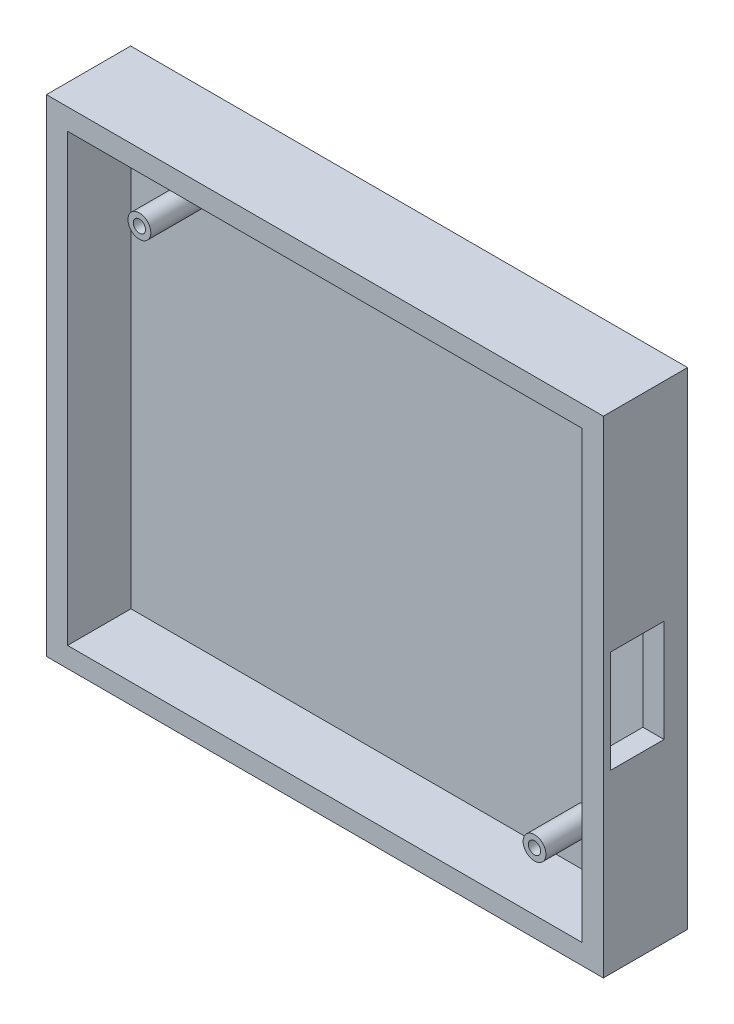
ISO-10303-21;
HEADER;
FILE_DESCRIPTION(('STEP AP214'),'2;1');
FILE_NAME('part.step','',(''),(''),'','','');
FILE_SCHEMA(('AUTOMOTIVE_DESIGN { 1 0 10303 214 1 1 1 1 }'));
ENDSEC;
DATA;
#1=APPLICATION_CONTEXT('core data for automotive mechanical design processes');
#2=APPLICATION_PROTOCOL_DEFINITION('international standard','automotive_design',2000,#1);
#3=PRODUCT_CONTEXT('',#1,'mechanical');
#4=PRODUCT('Part','Part','',(#3));
#5=PRODUCT_RELATED_PRODUCT_CATEGORY('part','',(#4));
#6=PRODUCT_DEFINITION_FORMATION('','',#4);
#7=PRODUCT_DEFINITION_CONTEXT('part definition',#1,'design');
#8=PRODUCT_DEFINITION('design','',#6,#7);
#9=PRODUCT_DEFINITION_SHAPE('','',#8);
#10=(LENGTH_UNIT() NAMED_UNIT(*) SI_UNIT(.MILLI.,.METRE.));
#11=(NAMED_UNIT(*) PLANE_ANGLE_UNIT() SI_UNIT($,.RADIAN.));
#12=(NAMED_UNIT(*) SI_UNIT($,.STERADIAN.) SOLID_ANGLE_UNIT());
#13=UNCERTAINTY_MEASURE_WITH_UNIT(LENGTH_MEASURE(1.E-05),#10,'distance_accuracy_value','');
#14=(GEOMETRIC_REPRESENTATION_CONTEXT(3) GLOBAL_UNCERTAINTY_ASSIGNED_CONTEXT((#13)) GLOBAL_UNIT_ASSIGNED_CONTEXT((#10,
#11,#12)) REPRESENTATION_CONTEXT('',''));
#15=CARTESIAN_POINT('',(0.,0.,0.));
#16=DIRECTION('',(0.,0.,1.));
#17=DIRECTION('',(1.,0.,0.));
#18=AXIS2_PLACEMENT_3D('',#15,#16,#17);
#19=CARTESIAN_POINT('',(0.,0.,1258.65249784237));
#20=DIRECTION('',(0.,0.,-1.));
#21=DIRECTION('',(-1.,0.,0.));
#22=AXIS2_PLACEMENT_3D('',#19,#20,#21);
#23=PLANE('',#22);
#24=DIRECTION('',(-1.,0.,0.));
#25=VECTOR('',#24,1.);
#26=CARTESIAN_POINT('',(0.,899.660798821983,1258.65249784237));
#27=LINE('',#26,#25);
#28=CARTESIAN_POINT('',(721.451856627697,899.660798821983,1258.65249784237));
#29=VERTEX_POINT('',#28);
#30=CARTESIAN_POINT('',(587.605010034027,899.660798821983,1258.65249784237));
#31=VERTEX_POINT('',#30);
#32=EDGE_CURVE('E180',#29,#31,#27,.T.);
#33=ORIENTED_EDGE('',*,*,#32,.F.);
#34=DIRECTION('',(0.,-1.,0.));
#35=VECTOR('',#34,1.);
#36=CARTESIAN_POINT('',(721.451856627697,0.,1258.65249784237));
#37=LINE('',#36,#35);
#38=CARTESIAN_POINT('',(721.451856627697,782.720878160815,1258.65249784237));
#39=VERTEX_POINT('',#38);
#40=EDGE_CURVE('E207',#29,#39,#37,.T.);
#41=ORIENTED_EDGE('',*,*,#40,.T.);
#42=DIRECTION('',(-1.,0.,0.));
#43=VECTOR('',#42,1.);
#44=CARTESIAN_POINT('',(0.,782.720878160815,1258.65249784237));
#45=LINE('',#44,#43);
#46=CARTESIAN_POINT('',(587.605010034027,782.720878160815,1258.65249784237));
#47=VERTEX_POINT('',#46);
#48=EDGE_CURVE('E215',#39,#47,#45,.T.);
#49=ORIENTED_EDGE('',*,*,#48,.T.);
#50=DIRECTION('',(0.,-1.,0.));
#51=VECTOR('',#50,1.);
#52=CARTESIAN_POINT('',(587.605010034027,0.,1258.65249784237));
#53=LINE('',#52,#51);
#54=EDGE_CURVE('E189',#31,#47,#53,.T.);
#55=ORIENTED_EDGE('',*,*,#54,.F.);
#56=EDGE_LOOP('',(#33,#41,#49,#55));
#57=FACE_BOUND('',#56,.T.);
#58=ADVANCED_FACE('F41',(#57),#23,.T.);
#59=CARTESIAN_POINT('',(716.371856627697,0.,1278.89249784237));
#60=DIRECTION('',(1.,0.,0.));
#61=DIRECTION('',(0.,0.,-1.));
#62=AXIS2_PLACEMENT_3D('',#59,#60,#61);
#63=PLANE('',#62);
#64=DIRECTION('',(0.,1.,0.));
#65=VECTOR('',#64,1.);
#66=CARTESIAN_POINT('',(716.371856627697,0.,1264.3012185459));
#67=LINE('',#66,#65);
#68=CARTESIAN_POINT('',(716.371856627697,825.075290209416,1264.3012185459));
#69=VERTEX_POINT('',#68);
#70=CARTESIAN_POINT('',(716.371856627697,849.699463737896,1264.3012185459));
#71=VERTEX_POINT('',#70);
#72=EDGE_CURVE('E159',#69,#71,#67,.T.);
#73=ORIENTED_EDGE('',*,*,#72,.T.);
#74=DIRECTION('',(0.,0.,1.));
#75=VECTOR('',#74,1.);
#76=CARTESIAN_POINT('',(716.371856627697,849.699463737896,1278.89249784237));
#77=LINE('',#76,#75);
#78=CARTESIAN_POINT('',(716.371856627697,849.699463737896,1277.13765715612));
#79=VERTEX_POINT('',#78);
#80=EDGE_CURVE('E162',#71,#79,#77,.T.);
#81=ORIENTED_EDGE('',*,*,#80,.T.);
#82=DIRECTION('',(0.,-1.,0.));
#83=VECTOR('',#82,1.);
#84=CARTESIAN_POINT('',(716.371856627697,0.,1277.13765715612));
#85=LINE('',#84,#83);
#86=CARTESIAN_POINT('',(716.371856627697,825.075290209416,1277.13765715612));
#87=VERTEX_POINT('',#86);
#88=EDGE_CURVE('E154',#79,#87,#85,.T.);
#89=ORIENTED_EDGE('',*,*,#88,.T.);
#90=DIRECTION('',(0.,0.,-1.));
#91=VECTOR('',#90,1.);
#92=CARTESIAN_POINT('',(716.371856627697,825.075290209416,1278.89249784237));
#93=LINE('',#92,#91);
#94=EDGE_CURVE('E132',#87,#69,#93,.T.);
#95=ORIENTED_EDGE('',*,*,#94,.T.);
#96=EDGE_LOOP('',(#73,#81,#89,#95));
#97=FACE_BOUND('',#96,.T.);
#98=DIRECTION('',(0.,0.,-1.));
#99=VECTOR('',#98,1.);
#100=CARTESIAN_POINT('',(716.371856627697,894.580798821983,1278.89249784237));
#101=LINE('',#100,#99);
#102=CARTESIAN_POINT('',(716.371856627697,894.580798821983,1278.89249784237));
#103=VERTEX_POINT('',#102);
#104=CARTESIAN_POINT('',(716.371856627697,894.580798821983,1263.65249784237));
#105=VERTEX_POINT('',#104);
#106=EDGE_CURVE('E206',#103,#105,#101,.T.);
#107=ORIENTED_EDGE('',*,*,#106,.T.);
#108=DIRECTION('',(0.,-1.,0.));
#109=VECTOR('',#108,1.);
#110=CARTESIAN_POINT('',(716.371856627697,0.,1263.65249784237));
#111=LINE('',#110,#109);
#112=CARTESIAN_POINT('',(716.371856627697,787.556428971502,1263.65249784237));
#113=VERTEX_POINT('',#112);
#114=EDGE_CURVE('E219',#105,#113,#111,.T.);
#115=ORIENTED_EDGE('',*,*,#114,.T.);
#116=DIRECTION('',(0.,0.,-1.));
#117=VECTOR('',#116,1.);
#118=CARTESIAN_POINT('',(716.371856627697,787.556428971502,1278.89249784237));
#119=LINE('',#118,#117);
#120=CARTESIAN_POINT('',(716.371856627697,787.556428971502,1278.89249784237));
#121=VERTEX_POINT('',#120);
#122=EDGE_CURVE('E230',#121,#113,#119,.T.);
#123=ORIENTED_EDGE('',*,*,#122,.F.);
#124=DIRECTION('',(0.,-1.,0.));
#125=VECTOR('',#124,1.);
#126=CARTESIAN_POINT('',(716.371856627697,0.,1278.89249784237));
#127=LINE('',#126,#125);
#128=EDGE_CURVE('E183',#103,#121,#127,.T.);
#129=ORIENTED_EDGE('',*,*,#128,.F.);
#130=EDGE_LOOP('',(#107,#115,#123,#129));
#131=FACE_BOUND('',#130,.T.);
#132=ADVANCED_FACE('F267',(#97,#131),#63,.F.);
#133=CARTESIAN_POINT('',(0.,787.556428971502,1278.89249784237));
#134=DIRECTION('',(0.,-1.,0.));
#135=DIRECTION('',(0.,0.,-1.));
#136=AXIS2_PLACEMENT_3D('',#133,#134,#135);
#137=PLANE('',#136);
#138=ORIENTED_EDGE('',*,*,#122,.T.);
#139=DIRECTION('',(-1.,0.,0.));
#140=VECTOR('',#139,1.);
#141=CARTESIAN_POINT('',(0.,787.556428971502,1263.65249784237));
#142=LINE('',#141,#140);
#143=CARTESIAN_POINT('',(592.685010034028,787.556428971502,1263.65249784237));
#144=VERTEX_POINT('',#143);
#145=EDGE_CURVE('E238',#113,#144,#142,.T.);
#146=ORIENTED_EDGE('',*,*,#145,.T.);
#147=DIRECTION('',(0.,0.,-1.));
#148=VECTOR('',#147,1.);
#149=CARTESIAN_POINT('',(592.685010034028,787.556428971502,1278.89249784237));
#150=LINE('',#149,#148);
#151=CARTESIAN_POINT('',(592.685010034028,787.556428971502,1278.89249784237));
#152=VERTEX_POINT('',#151);
#153=EDGE_CURVE('E227',#152,#144,#150,.T.);
#154=ORIENTED_EDGE('',*,*,#153,.F.);
#155=DIRECTION('',(-1.,0.,0.));
#156=VECTOR('',#155,1.);
#157=CARTESIAN_POINT('',(0.,787.556428971502,1278.89249784237));
#158=LINE('',#157,#156);
#159=EDGE_CURVE('E194',#121,#152,#158,.T.);
#160=ORIENTED_EDGE('',*,*,#159,.F.);
#161=EDGE_LOOP('',(#138,#146,#154,#160));
#162=FACE_BOUND('',#161,.T.);
#163=ADVANCED_FACE('F280',(#162),#137,.F.);
#164=CARTESIAN_POINT('',(0.,899.660798821983,1278.89249784237));
#165=DIRECTION('',(0.,-1.,0.));
#166=DIRECTION('',(0.,0.,-1.));
#167=AXIS2_PLACEMENT_3D('',#164,#165,#166);
#168=PLANE('',#167);
#169=ORIENTED_EDGE('',*,*,#32,.T.);
#170=DIRECTION('',(0.,0.,-1.));
#171=VECTOR('',#170,1.);
#172=CARTESIAN_POINT('',(587.605010034027,899.660798821983,1278.89249784237));
#173=LINE('',#172,#171);
#174=CARTESIAN_POINT('',(587.605010034027,899.660798821983,1278.89249784237));
#175=VERTEX_POINT('',#174);
#176=EDGE_CURVE('E220',#175,#31,#173,.T.);
#177=ORIENTED_EDGE('',*,*,#176,.F.);
#178=DIRECTION('',(-1.,0.,0.));
#179=VECTOR('',#178,1.);
#180=CARTESIAN_POINT('',(0.,899.660798821983,1278.89249784237));
#181=LINE('',#180,#179);
#182=CARTESIAN_POINT('',(721.451856627697,899.660798821983,1278.89249784237));
#183=VERTEX_POINT('',#182);
#184=EDGE_CURVE('E193',#183,#175,#181,.T.);
#185=ORIENTED_EDGE('',*,*,#184,.F.);
#186=DIRECTION('',(0.,0.,-1.));
#187=VECTOR('',#186,1.);
#188=CARTESIAN_POINT('',(721.451856627697,899.660798821983,1278.89249784237));
#189=LINE('',#188,#187);
#190=EDGE_CURVE('E223',#183,#29,#189,.T.);
#191=ORIENTED_EDGE('',*,*,#190,.T.);
#192=EDGE_LOOP('',(#169,#177,#185,#191));
#193=FACE_BOUND('',#192,.T.);
#194=ADVANCED_FACE('F276',(#193),#168,.F.);
#195=CARTESIAN_POINT('',(587.605010034027,0.,1278.89249784237));
#196=DIRECTION('',(1.,0.,0.));
#197=DIRECTION('',(0.,0.,-1.));
#198=AXIS2_PLACEMENT_3D('',#195,#196,#197);
#199=PLANE('',#198);
#200=ORIENTED_EDGE('',*,*,#54,.T.);
#201=DIRECTION('',(0.,0.,-1.));
#202=VECTOR('',#201,1.);
#203=CARTESIAN_POINT('',(587.605010034027,782.720878160815,1278.89249784237));
#204=LINE('',#203,#202);
#205=CARTESIAN_POINT('',(587.605010034027,782.720878160815,1278.89249784237));
#206=VERTEX_POINT('',#205);
#207=EDGE_CURVE('E222',#206,#47,#204,.T.);
#208=ORIENTED_EDGE('',*,*,#207,.F.);
#209=DIRECTION('',(0.,-1.,0.));
#210=VECTOR('',#209,1.);
#211=CARTESIAN_POINT('',(587.605010034027,0.,1278.89249784237));
#212=LINE('',#211,#210);
#213=EDGE_CURVE('E204',#175,#206,#212,.T.);
#214=ORIENTED_EDGE('',*,*,#213,.F.);
#215=ORIENTED_EDGE('',*,*,#176,.T.);
#216=EDGE_LOOP('',(#200,#208,#214,#215));
#217=FACE_BOUND('',#216,.T.);
#218=ADVANCED_FACE('F282',(#217),#199,.F.);
#219=CARTESIAN_POINT('',(0.,782.720878160815,1278.89249784237));
#220=DIRECTION('',(0.,-1.,0.));
#221=DIRECTION('',(0.,0.,-1.));
#222=AXIS2_PLACEMENT_3D('',#219,#220,#221);
#223=PLANE('',#222);
#224=ORIENTED_EDGE('',*,*,#48,.F.);
#225=DIRECTION('',(0.,0.,-1.));
#226=VECTOR('',#225,1.);
#227=CARTESIAN_POINT('',(721.451856627697,782.720878160815,1278.89249784237));
#228=LINE('',#227,#226);
#229=CARTESIAN_POINT('',(721.451856627697,782.720878160815,1278.89249784237));
#230=VERTEX_POINT('',#229);
#231=EDGE_CURVE('E224',#230,#39,#228,.T.);
#232=ORIENTED_EDGE('',*,*,#231,.F.);
#233=DIRECTION('',(-1.,0.,0.));
#234=VECTOR('',#233,1.);
#235=CARTESIAN_POINT('',(0.,782.720878160815,1278.89249784237));
#236=LINE('',#235,#234);
#237=EDGE_CURVE('E203',#230,#206,#236,.T.);
#238=ORIENTED_EDGE('',*,*,#237,.T.);
#239=ORIENTED_EDGE('',*,*,#207,.T.);
#240=EDGE_LOOP('',(#224,#232,#238,#239));
#241=FACE_BOUND('',#240,.T.);
#242=ADVANCED_FACE('F304',(#241),#223,.T.);
#243=CARTESIAN_POINT('',(592.685010034028,0.,1278.89249784237));
#244=DIRECTION('',(-1.,0.,0.));
#245=DIRECTION('',(0.,0.,1.));
#246=AXIS2_PLACEMENT_3D('',#243,#244,#245);
#247=PLANE('',#246);
#248=DIRECTION('',(0.,-1.,0.));
#249=VECTOR('',#248,1.);
#250=CARTESIAN_POINT('',(592.685010034028,0.,1263.65249784237));
#251=LINE('',#250,#249);
#252=CARTESIAN_POINT('',(592.685010034028,894.580798821983,1263.65249784237));
#253=VERTEX_POINT('',#252);
#254=EDGE_CURVE('E241',#253,#144,#251,.T.);
#255=ORIENTED_EDGE('',*,*,#254,.F.);
#256=DIRECTION('',(0.,0.,-1.));
#257=VECTOR('',#256,1.);
#258=CARTESIAN_POINT('',(592.685010034028,894.580798821983,1278.89249784237));
#259=LINE('',#258,#257);
#260=CARTESIAN_POINT('',(592.685010034028,894.580798821983,1278.89249784237));
#261=VERTEX_POINT('',#260);
#262=EDGE_CURVE('E234',#261,#253,#259,.T.);
#263=ORIENTED_EDGE('',*,*,#262,.F.);
#264=DIRECTION('',(0.,1.,0.));
#265=VECTOR('',#264,1.);
#266=CARTESIAN_POINT('',(592.685010034028,0.,1278.89249784237));
#267=LINE('',#266,#265);
#268=EDGE_CURVE('E192',#152,#261,#267,.T.);
#269=ORIENTED_EDGE('',*,*,#268,.F.);
#270=ORIENTED_EDGE('',*,*,#153,.T.);
#271=EDGE_LOOP('',(#255,#263,#269,#270));
#272=FACE_BOUND('',#271,.T.);
#273=ADVANCED_FACE('F274',(#272),#247,.F.);
#274=CARTESIAN_POINT('',(0.,894.580798821983,1278.89249784237));
#275=DIRECTION('',(0.,1.,0.));
#276=DIRECTION('',(0.,0.,1.));
#277=AXIS2_PLACEMENT_3D('',#274,#275,#276);
#278=PLANE('',#277);
#279=DIRECTION('',(-1.,0.,0.));
#280=VECTOR('',#279,1.);
#281=CARTESIAN_POINT('',(0.,894.580798821983,1263.65249784237));
#282=LINE('',#281,#280);
#283=EDGE_CURVE('E242',#105,#253,#282,.T.);
#284=ORIENTED_EDGE('',*,*,#283,.F.);
#285=ORIENTED_EDGE('',*,*,#106,.F.);
#286=DIRECTION('',(1.,0.,0.));
#287=VECTOR('',#286,1.);
#288=CARTESIAN_POINT('',(0.,894.580798821983,1278.89249784237));
#289=LINE('',#288,#287);
#290=EDGE_CURVE('E186',#261,#103,#289,.T.);
#291=ORIENTED_EDGE('',*,*,#290,.F.);
#292=ORIENTED_EDGE('',*,*,#262,.T.);
#293=EDGE_LOOP('',(#284,#285,#291,#292));
#294=FACE_BOUND('',#293,.T.);
#295=ADVANCED_FACE('F264',(#294),#278,.F.);
#296=CARTESIAN_POINT('',(721.451856627697,0.,1278.89249784237));
#297=DIRECTION('',(1.,0.,0.));
#298=DIRECTION('',(0.,0.,-1.));
#299=AXIS2_PLACEMENT_3D('',#296,#297,#298);
#300=PLANE('',#299);
#301=DIRECTION('',(0.,0.,1.));
#302=VECTOR('',#301,1.);
#303=CARTESIAN_POINT('',(721.451856627697,849.699463737896,1277.13765715612));
#304=LINE('',#303,#302);
#305=CARTESIAN_POINT('',(721.451856627697,849.699463737896,1264.3012185459));
#306=VERTEX_POINT('',#305);
#307=CARTESIAN_POINT('',(721.451856627697,849.699463737896,1277.13765715612));
#308=VERTEX_POINT('',#307);
#309=EDGE_CURVE('E61',#306,#308,#304,.T.);
#310=ORIENTED_EDGE('',*,*,#309,.F.);
#311=DIRECTION('',(0.,1.,0.));
#312=VECTOR('',#311,1.);
#313=CARTESIAN_POINT('',(721.451856627697,849.699463737896,1264.3012185459));
#314=LINE('',#313,#312);
#315=CARTESIAN_POINT('',(721.451856627697,825.075290209416,1264.3012185459));
#316=VERTEX_POINT('',#315);
#317=EDGE_CURVE('E146',#316,#306,#314,.T.);
#318=ORIENTED_EDGE('',*,*,#317,.F.);
#319=DIRECTION('',(0.,0.,-1.));
#320=VECTOR('',#319,1.);
#321=CARTESIAN_POINT('',(721.451856627697,825.075290209416,1277.13765715612));
#322=LINE('',#321,#320);
#323=CARTESIAN_POINT('',(721.451856627697,825.075290209416,1277.13765715612));
#324=VERTEX_POINT('',#323);
#325=EDGE_CURVE('E135',#324,#316,#322,.T.);
#326=ORIENTED_EDGE('',*,*,#325,.F.);
#327=DIRECTION('',(0.,-1.,0.));
#328=VECTOR('',#327,1.);
#329=CARTESIAN_POINT('',(721.451856627697,849.699463737896,1277.13765715612));
#330=LINE('',#329,#328);
#331=EDGE_CURVE('E143',#308,#324,#330,.T.);
#332=ORIENTED_EDGE('',*,*,#331,.F.);
#333=EDGE_LOOP('',(#310,#318,#326,#332));
#334=FACE_BOUND('',#333,.T.);
#335=ORIENTED_EDGE('',*,*,#40,.F.);
#336=ORIENTED_EDGE('',*,*,#190,.F.);
#337=DIRECTION('',(0.,-1.,0.));
#338=VECTOR('',#337,1.);
#339=CARTESIAN_POINT('',(721.451856627697,0.,1278.89249784237));
#340=LINE('',#339,#338);
#341=EDGE_CURVE('E196',#183,#230,#340,.T.);
#342=ORIENTED_EDGE('',*,*,#341,.T.);
#343=ORIENTED_EDGE('',*,*,#231,.T.);
#344=EDGE_LOOP('',(#335,#336,#342,#343));
#345=FACE_BOUND('',#344,.T.);
#346=ADVANCED_FACE('F144',(#334,#345),#300,.T.);
#347=CARTESIAN_POINT('',(0.,0.,1278.89249784237));
#348=DIRECTION('',(0.,0.,-1.));
#349=DIRECTION('',(-1.,0.,0.));
#350=AXIS2_PLACEMENT_3D('',#347,#348,#349);
#351=PLANE('',#350);
#352=ORIENTED_EDGE('',*,*,#128,.T.);
#353=ORIENTED_EDGE('',*,*,#159,.T.);
#354=ORIENTED_EDGE('',*,*,#268,.T.);
#355=ORIENTED_EDGE('',*,*,#290,.T.);
#356=EDGE_LOOP('',(#352,#353,#354,#355));
#357=FACE_BOUND('',#356,.T.);
#358=ORIENTED_EDGE('',*,*,#184,.T.);
#359=ORIENTED_EDGE('',*,*,#213,.T.);
#360=ORIENTED_EDGE('',*,*,#237,.F.);
#361=ORIENTED_EDGE('',*,*,#341,.F.);
#362=EDGE_LOOP('',(#358,#359,#360,#361));
#363=FACE_BOUND('',#362,.T.);
#364=ADVANCED_FACE('F254',(#357,#363),#351,.F.);
#365=CARTESIAN_POINT('',(0.,0.,1263.65249784237));
#366=DIRECTION('',(0.,0.,-1.));
#367=DIRECTION('',(-1.,0.,0.));
#368=AXIS2_PLACEMENT_3D('',#365,#366,#367);
#369=PLANE('',#368);
#370=CARTESIAN_POINT('',(607.327962295804,880.840943569991,1263.65249784237));
#371=DIRECTION('',(0.,0.,-1.));
#372=DIRECTION('',(-1.,0.,0.));
#373=AXIS2_PLACEMENT_3D('',#370,#371,#372);
#374=CIRCLE('',#373,2.74500000000004);
#375=CARTESIAN_POINT('',(604.582962295804,880.840943569991,1263.65249784237));
#376=VERTEX_POINT('',#375);
#377=EDGE_CURVE('E11',#376,#376,#374,.F.);
#378=ORIENTED_EDGE('',*,*,#377,.F.);
#379=EDGE_LOOP('',(#378));
#380=FACE_BOUND('',#379,.T.);
#381=CARTESIAN_POINT('',(702.289411045068,798.927110343082,1263.65249784237));
#382=DIRECTION('',(0.,0.,-1.));
#383=DIRECTION('',(-1.,0.,0.));
#384=AXIS2_PLACEMENT_3D('',#381,#382,#383);
#385=CIRCLE('',#384,2.74500000000004);
#386=CARTESIAN_POINT('',(699.544411045068,798.927110343082,1263.65249784237));
#387=VERTEX_POINT('',#386);
#388=EDGE_CURVE('E48',#387,#387,#385,.F.);
#389=ORIENTED_EDGE('',*,*,#388,.F.);
#390=EDGE_LOOP('',(#389));
#391=FACE_BOUND('',#390,.T.);
#392=ORIENTED_EDGE('',*,*,#114,.F.);
#393=ORIENTED_EDGE('',*,*,#283,.T.);
#394=ORIENTED_EDGE('',*,*,#254,.T.);
#395=ORIENTED_EDGE('',*,*,#145,.F.);
#396=EDGE_LOOP('',(#392,#393,#394,#395));
#397=FACE_BOUND('',#396,.T.);
#398=ADVANCED_FACE('F253',(#380,#391,#397),#369,.F.);
#399=CARTESIAN_POINT('',(702.289411045068,798.927110343082,1276.27249784237));
#400=DIRECTION('',(0.,0.,1.));
#401=DIRECTION('',(1.,0.,0.));
#402=AXIS2_PLACEMENT_3D('',#399,#400,#401);
#403=PLANE('',#402);
#404=CARTESIAN_POINT('',(702.289411045068,798.927110343082,1276.27249784237));
#405=DIRECTION('',(0.,0.,1.));
#406=DIRECTION('',(1.,0.,0.));
#407=AXIS2_PLACEMENT_3D('',#404,#405,#406);
#408=CIRCLE('',#407,2.74500000000004);
#409=CARTESIAN_POINT('',(705.034411045068,798.927110343082,1276.27249784237));
#410=VERTEX_POINT('',#409);
#411=EDGE_CURVE('E167',#410,#410,#408,.T.);
#412=ORIENTED_EDGE('',*,*,#411,.T.);
#413=EDGE_LOOP('',(#412));
#414=FACE_BOUND('',#413,.T.);
#415=CARTESIAN_POINT('',(702.289411045068,798.927110343082,1276.27249784237));
#416=DIRECTION('',(0.,0.,1.));
#417=DIRECTION('',(1.,0.,0.));
#418=AXIS2_PLACEMENT_3D('',#415,#416,#417);
#419=CIRCLE('',#418,1.47500000000002);
#420=CARTESIAN_POINT('',(703.764411045068,798.927110343082,1276.27249784237));
#421=VERTEX_POINT('',#420);
#422=EDGE_CURVE('E178',#421,#421,#419,.T.);
#423=ORIENTED_EDGE('',*,*,#422,.F.);
#424=EDGE_LOOP('',(#423));
#425=FACE_BOUND('',#424,.T.);
#426=ADVANCED_FACE('F255',(#414,#425),#403,.T.);
#427=CARTESIAN_POINT('',(702.289411045068,798.927110343082,1276.27249784237));
#428=DIRECTION('',(0.,0.,-1.));
#429=DIRECTION('',(-1.,0.,0.));
#430=AXIS2_PLACEMENT_3D('',#427,#428,#429);
#431=CYLINDRICAL_SURFACE('',#430,2.74500000000004);
#432=ORIENTED_EDGE('',*,*,#411,.F.);
#433=EDGE_LOOP('',(#432));
#434=FACE_BOUND('',#433,.T.);
#435=ORIENTED_EDGE('',*,*,#388,.T.);
#436=EDGE_LOOP('',(#435));
#437=FACE_BOUND('',#436,.T.);
#438=ADVANCED_FACE('F246',(#434,#437),#431,.T.);
#439=CARTESIAN_POINT('',(702.289411045068,798.927110343082,1276.27249784237));
#440=DIRECTION('',(0.,0.,-1.));
#441=DIRECTION('',(-1.,0.,0.));
#442=AXIS2_PLACEMENT_3D('',#439,#440,#441);
#443=CYLINDRICAL_SURFACE('',#442,1.47500000000002);
#444=ORIENTED_EDGE('',*,*,#422,.T.);
#445=EDGE_LOOP('',(#444));
#446=FACE_BOUND('',#445,.T.);
#447=CARTESIAN_POINT('',(702.289411045068,798.927110343082,1263.65249784237));
#448=DIRECTION('',(0.,0.,1.));
#449=DIRECTION('',(1.,0.,0.));
#450=AXIS2_PLACEMENT_3D('',#447,#448,#449);
#451=CIRCLE('',#450,1.47500000000002);
#452=CARTESIAN_POINT('',(703.764411045068,798.927110343082,1263.65249784237));
#453=VERTEX_POINT('',#452);
#454=EDGE_CURVE('E174',#453,#453,#451,.T.);
#455=ORIENTED_EDGE('',*,*,#454,.F.);
#456=EDGE_LOOP('',(#455));
#457=FACE_BOUND('',#456,.T.);
#458=ADVANCED_FACE('F312',(#446,#457),#443,.F.);
#459=CARTESIAN_POINT('',(607.327962295804,880.840943569991,1276.27249784237));
#460=DIRECTION('',(0.,0.,1.));
#461=DIRECTION('',(1.,0.,0.));
#462=AXIS2_PLACEMENT_3D('',#459,#460,#461);
#463=PLANE('',#462);
#464=CARTESIAN_POINT('',(607.327962295804,880.840943569991,1276.27249784237));
#465=DIRECTION('',(0.,0.,1.));
#466=DIRECTION('',(1.,0.,0.));
#467=AXIS2_PLACEMENT_3D('',#464,#465,#466);
#468=CIRCLE('',#467,2.74500000000004);
#469=CARTESIAN_POINT('',(610.072962295804,880.840943569991,1276.27249784237));
#470=VERTEX_POINT('',#469);
#471=EDGE_CURVE('E168',#470,#470,#468,.T.);
#472=ORIENTED_EDGE('',*,*,#471,.T.);
#473=EDGE_LOOP('',(#472));
#474=FACE_BOUND('',#473,.T.);
#475=CARTESIAN_POINT('',(607.327962295804,880.840943569991,1276.27249784237));
#476=DIRECTION('',(0.,0.,1.));
#477=DIRECTION('',(1.,0.,0.));
#478=AXIS2_PLACEMENT_3D('',#475,#476,#477);
#479=CIRCLE('',#478,1.47500000000002);
#480=CARTESIAN_POINT('',(608.802962295804,880.840943569991,1276.27249784237));
#481=VERTEX_POINT('',#480);
#482=EDGE_CURVE('E170',#481,#481,#479,.T.);
#483=ORIENTED_EDGE('',*,*,#482,.F.);
#484=EDGE_LOOP('',(#483));
#485=FACE_BOUND('',#484,.T.);
#486=ADVANCED_FACE('F383',(#474,#485),#463,.T.);
#487=CARTESIAN_POINT('',(607.327962295804,880.840943569991,1276.27249784237));
#488=DIRECTION('',(0.,0.,-1.));
#489=DIRECTION('',(-1.,0.,0.));
#490=AXIS2_PLACEMENT_3D('',#487,#488,#489);
#491=CYLINDRICAL_SURFACE('',#490,2.74500000000004);
#492=ORIENTED_EDGE('',*,*,#471,.F.);
#493=EDGE_LOOP('',(#492));
#494=FACE_BOUND('',#493,.T.);
#495=ORIENTED_EDGE('',*,*,#377,.T.);
#496=EDGE_LOOP('',(#495));
#497=FACE_BOUND('',#496,.T.);
#498=ADVANCED_FACE('F391',(#494,#497),#491,.T.);
#499=CARTESIAN_POINT('',(607.327962295804,880.840943569991,1276.27249784237));
#500=DIRECTION('',(0.,0.,-1.));
#501=DIRECTION('',(-1.,0.,0.));
#502=AXIS2_PLACEMENT_3D('',#499,#500,#501);
#503=CYLINDRICAL_SURFACE('',#502,1.47500000000002);
#504=ORIENTED_EDGE('',*,*,#482,.T.);
#505=EDGE_LOOP('',(#504));
#506=FACE_BOUND('',#505,.T.);
#507=CARTESIAN_POINT('',(607.327962295804,880.840943569991,1263.65249784237));
#508=DIRECTION('',(0.,0.,1.));
#509=DIRECTION('',(1.,0.,0.));
#510=AXIS2_PLACEMENT_3D('',#507,#508,#509);
#511=CIRCLE('',#510,1.47500000000002);
#512=CARTESIAN_POINT('',(608.802962295804,880.840943569991,1263.65249784237));
#513=VERTEX_POINT('',#512);
#514=EDGE_CURVE('E173',#513,#513,#511,.T.);
#515=ORIENTED_EDGE('',*,*,#514,.F.);
#516=EDGE_LOOP('',(#515));
#517=FACE_BOUND('',#516,.T.);
#518=ADVANCED_FACE('F353',(#506,#517),#503,.F.);
#519=ORIENTED_EDGE('',*,*,#454,.T.);
#520=EDGE_LOOP('',(#519));
#521=FACE_BOUND('',#520,.T.);
#522=ADVANCED_FACE('F256',(#521),#369,.F.);
#523=ORIENTED_EDGE('',*,*,#514,.T.);
#524=EDGE_LOOP('',(#523));
#525=FACE_BOUND('',#524,.T.);
#526=ADVANCED_FACE('F260',(#525),#369,.F.);
#527=CARTESIAN_POINT('',(711.451856627697,849.699463737896,1277.13765715612));
#528=DIRECTION('',(0.,1.,0.));
#529=DIRECTION('',(0.,0.,1.));
#530=AXIS2_PLACEMENT_3D('',#527,#528,#529);
#531=PLANE('',#530);
#532=DIRECTION('',(1.,0.,0.));
#533=VECTOR('',#532,1.);
#534=CARTESIAN_POINT('',(711.451856627697,849.699463737896,1264.3012185459));
#535=LINE('',#534,#533);
#536=EDGE_CURVE('E153',#71,#306,#535,.T.);
#537=ORIENTED_EDGE('',*,*,#536,.T.);
#538=ORIENTED_EDGE('',*,*,#309,.T.);
#539=DIRECTION('',(1.,0.,0.));
#540=VECTOR('',#539,1.);
#541=CARTESIAN_POINT('',(711.451856627697,849.699463737896,1277.13765715612));
#542=LINE('',#541,#540);
#543=EDGE_CURVE('E139',#79,#308,#542,.T.);
#544=ORIENTED_EDGE('',*,*,#543,.F.);
#545=ORIENTED_EDGE('',*,*,#80,.F.);
#546=EDGE_LOOP('',(#537,#538,#544,#545));
#547=FACE_BOUND('',#546,.T.);
#548=ADVANCED_FACE('F356',(#547),#531,.F.);
#549=CARTESIAN_POINT('',(711.451856627697,849.699463737896,1264.3012185459));
#550=DIRECTION('',(0.,0.,-1.));
#551=DIRECTION('',(-1.,0.,0.));
#552=AXIS2_PLACEMENT_3D('',#549,#550,#551);
#553=PLANE('',#552);
#554=DIRECTION('',(1.,0.,0.));
#555=VECTOR('',#554,1.);
#556=CARTESIAN_POINT('',(711.451856627697,825.075290209416,1264.3012185459));
#557=LINE('',#556,#555);
#558=EDGE_CURVE('E140',#69,#316,#557,.T.);
#559=ORIENTED_EDGE('',*,*,#558,.T.);
#560=ORIENTED_EDGE('',*,*,#317,.T.);
#561=ORIENTED_EDGE('',*,*,#536,.F.);
#562=ORIENTED_EDGE('',*,*,#72,.F.);
#563=EDGE_LOOP('',(#559,#560,#561,#562));
#564=FACE_BOUND('',#563,.T.);
#565=ADVANCED_FACE('F419',(#564),#553,.F.);
#566=CARTESIAN_POINT('',(711.451856627697,825.075290209416,1277.13765715612));
#567=DIRECTION('',(0.,-1.,0.));
#568=DIRECTION('',(0.,0.,-1.));
#569=AXIS2_PLACEMENT_3D('',#566,#567,#568);
#570=PLANE('',#569);
#571=DIRECTION('',(1.,0.,0.));
#572=VECTOR('',#571,1.);
#573=CARTESIAN_POINT('',(711.451856627697,825.075290209416,1277.13765715612));
#574=LINE('',#573,#572);
#575=EDGE_CURVE('E54',#87,#324,#574,.T.);
#576=ORIENTED_EDGE('',*,*,#575,.T.);
#577=ORIENTED_EDGE('',*,*,#325,.T.);
#578=ORIENTED_EDGE('',*,*,#558,.F.);
#579=ORIENTED_EDGE('',*,*,#94,.F.);
#580=EDGE_LOOP('',(#576,#577,#578,#579));
#581=FACE_BOUND('',#580,.T.);
#582=ADVANCED_FACE('F129',(#581),#570,.F.);
#583=CARTESIAN_POINT('',(711.451856627697,849.699463737896,1277.13765715612));
#584=DIRECTION('',(0.,0.,1.));
#585=DIRECTION('',(1.,0.,0.));
#586=AXIS2_PLACEMENT_3D('',#583,#584,#585);
#587=PLANE('',#586);
#588=ORIENTED_EDGE('',*,*,#543,.T.);
#589=ORIENTED_EDGE('',*,*,#331,.T.);
#590=ORIENTED_EDGE('',*,*,#575,.F.);
#591=ORIENTED_EDGE('',*,*,#88,.F.);
#592=EDGE_LOOP('',(#588,#589,#590,#591));
#593=FACE_BOUND('',#592,.T.);
#594=ADVANCED_FACE('F142',(#593),#587,.F.);
#595=CLOSED_SHELL('',(#58,#132,#163,#194,#218,#242,#273,#295,#346,#364,#398,#426,#438,#458,#486,
#498,#518,#522,#526,#548,#565,#582,#594));
#596=MANIFOLD_SOLID_BREP('B2',#595);
#597=ADVANCED_BREP_SHAPE_REPRESENTATION('',(#18,#596),#14);
#598=SHAPE_DEFINITION_REPRESENTATION(#9,#597);
ENDSEC;
END-ISO-10303-21;
